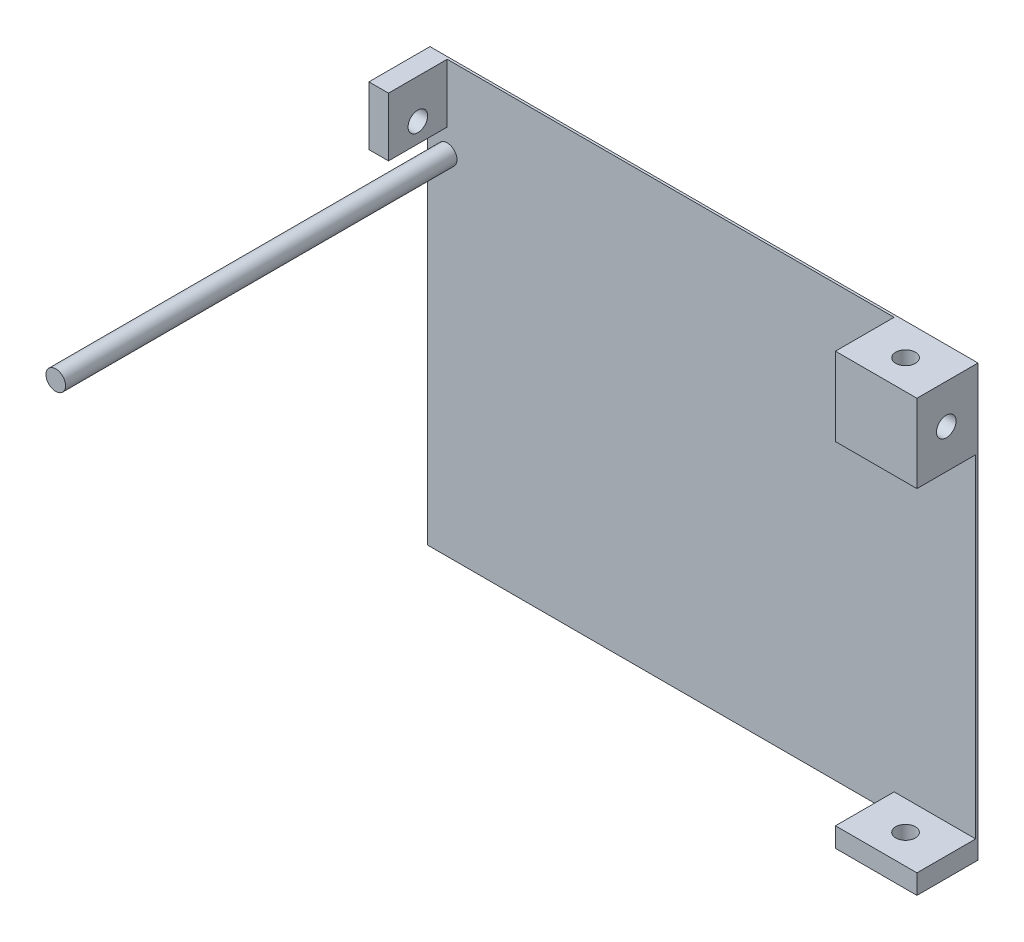
ISO-10303-21;
HEADER;
FILE_DESCRIPTION(('STEP AP214'),'2;1');
FILE_NAME('part.step','',(''),(''),'','','');
FILE_SCHEMA(('AUTOMOTIVE_DESIGN { 1 0 10303 214 1 1 1 1 }'));
ENDSEC;
DATA;
#1=APPLICATION_CONTEXT('core data for automotive mechanical design processes');
#2=APPLICATION_PROTOCOL_DEFINITION('international standard','automotive_design',2000,#1);
#3=PRODUCT_CONTEXT('',#1,'mechanical');
#4=PRODUCT('Part','Part','',(#3));
#5=PRODUCT_RELATED_PRODUCT_CATEGORY('part','',(#4));
#6=PRODUCT_DEFINITION_FORMATION('','',#4);
#7=PRODUCT_DEFINITION_CONTEXT('part definition',#1,'design');
#8=PRODUCT_DEFINITION('design','',#6,#7);
#9=PRODUCT_DEFINITION_SHAPE('','',#8);
#10=(LENGTH_UNIT() NAMED_UNIT(*) SI_UNIT(.MILLI.,.METRE.));
#11=(NAMED_UNIT(*) PLANE_ANGLE_UNIT() SI_UNIT($,.RADIAN.));
#12=(NAMED_UNIT(*) SI_UNIT($,.STERADIAN.) SOLID_ANGLE_UNIT());
#13=UNCERTAINTY_MEASURE_WITH_UNIT(LENGTH_MEASURE(1.E-05),#10,'distance_accuracy_value','');
#14=(GEOMETRIC_REPRESENTATION_CONTEXT(3) GLOBAL_UNCERTAINTY_ASSIGNED_CONTEXT((#13)) GLOBAL_UNIT_ASSIGNED_CONTEXT((#10,
#11,#12)) REPRESENTATION_CONTEXT('',''));
#15=CARTESIAN_POINT('',(0.,0.,0.));
#16=DIRECTION('',(0.,0.,1.));
#17=DIRECTION('',(1.,0.,0.));
#18=AXIS2_PLACEMENT_3D('',#15,#16,#17);
#19=CARTESIAN_POINT('',(297.95271691231,295.,40.5));
#20=DIRECTION('',(0.,-1.,0.));
#21=DIRECTION('',(1.,0.,0.));
#22=AXIS2_PLACEMENT_3D('',#19,#20,#21);
#23=CYLINDRICAL_SURFACE('',#22,12.5);
#24=CARTESIAN_POINT('',(297.95271691231,175.,40.5));
#25=DIRECTION('',(0.,1.,0.));
#26=DIRECTION('',(-1.,0.,0.));
#27=AXIS2_PLACEMENT_3D('',#24,#25,#26);
#28=CIRCLE('',#27,12.5);
#29=CARTESIAN_POINT('',(285.45271691231,175.,40.5));
#30=VERTEX_POINT('',#29);
#31=EDGE_CURVE('E166',#30,#30,#28,.T.);
#32=ORIENTED_EDGE('',*,*,#31,.F.);
#33=EDGE_LOOP('',(#32));
#34=FACE_BOUND('',#33,.T.);
#35=CARTESIAN_POINT('',(297.95271691231,225.,40.5));
#36=DIRECTION('',(-0.707106781186547,-0.707106781186547,0.));
#37=DIRECTION('',(0.707106781186547,-0.707106781186547,0.));
#38=AXIS2_PLACEMENT_3D('',#35,#36,#37);
#39=ELLIPSE('',#38,17.6776695296637,12.5);
#40=CARTESIAN_POINT('',(297.95271691231,225.,53.));
#41=VERTEX_POINT('',#40);
#42=CARTESIAN_POINT('',(297.95271691231,225.,28.));
#43=VERTEX_POINT('',#42);
#44=EDGE_CURVE('E57',#41,#43,#39,.F.);
#45=ORIENTED_EDGE('',*,*,#44,.T.);
#46=CARTESIAN_POINT('',(297.95271691231,225.,40.5));
#47=DIRECTION('',(0.707106781186547,-0.707106781186547,0.));
#48=DIRECTION('',(-0.707106781186547,-0.707106781186547,0.));
#49=AXIS2_PLACEMENT_3D('',#46,#47,#48);
#50=ELLIPSE('',#49,17.6776695296637,12.5);
#51=EDGE_CURVE('E11',#43,#41,#50,.F.);
#52=ORIENTED_EDGE('',*,*,#51,.T.);
#53=EDGE_LOOP('',(#45,#52));
#54=FACE_BOUND('',#53,.T.);
#55=ADVANCED_FACE('F43',(#34,#54),#23,.F.);
#56=CARTESIAN_POINT('',(0.,0.,3.));
#57=DIRECTION('',(0.,0.,1.));
#58=DIRECTION('',(1.,0.,0.));
#59=AXIS2_PLACEMENT_3D('',#56,#57,#58);
#60=PLANE('',#59);
#61=CARTESIAN_POINT('',(-325.,170.,3.));
#62=DIRECTION('',(0.,0.,1.));
#63=DIRECTION('',(1.,0.,0.));
#64=AXIS2_PLACEMENT_3D('',#61,#62,#63);
#65=CIRCLE('',#64,12.5);
#66=CARTESIAN_POINT('',(-312.5,170.,3.));
#67=VERTEX_POINT('',#66);
#68=EDGE_CURVE('E334',#67,#67,#65,.T.);
#69=ORIENTED_EDGE('',*,*,#68,.F.);
#70=EDGE_LOOP('',(#69));
#71=FACE_BOUND('',#70,.T.);
#72=DIRECTION('',(1.,0.,0.));
#73=VECTOR('',#72,1.);
#74=CARTESIAN_POINT('',(350.,-275.,3.));
#75=LINE('',#74,#73);
#76=CARTESIAN_POINT('',(-350.,-275.,3.));
#77=VERTEX_POINT('',#76);
#78=CARTESIAN_POINT('',(245.90543382462,-275.,3.));
#79=VERTEX_POINT('',#78);
#80=EDGE_CURVE('E204',#77,#79,#75,.T.);
#81=ORIENTED_EDGE('',*,*,#80,.T.);
#82=DIRECTION('',(0.,-1.,0.));
#83=VECTOR('',#82,1.);
#84=CARTESIAN_POINT('',(245.90543382462,-275.,3.));
#85=LINE('',#84,#83);
#86=CARTESIAN_POINT('',(245.90543382462,-250.,3.));
#87=VERTEX_POINT('',#86);
#88=EDGE_CURVE('E65',#87,#79,#85,.T.);
#89=ORIENTED_EDGE('',*,*,#88,.F.);
#90=DIRECTION('',(-1.,0.,0.));
#91=VECTOR('',#90,1.);
#92=CARTESIAN_POINT('',(245.90543382462,-250.,3.));
#93=LINE('',#92,#91);
#94=CARTESIAN_POINT('',(350.,-250.,3.));
#95=VERTEX_POINT('',#94);
#96=EDGE_CURVE('E280',#95,#87,#93,.T.);
#97=ORIENTED_EDGE('',*,*,#96,.F.);
#98=DIRECTION('',(0.,1.,0.));
#99=VECTOR('',#98,1.);
#100=CARTESIAN_POINT('',(350.,-275.,3.));
#101=LINE('',#100,#99);
#102=CARTESIAN_POINT('',(350.,175.,3.));
#103=VERTEX_POINT('',#102);
#104=EDGE_CURVE('E201',#95,#103,#101,.T.);
#105=ORIENTED_EDGE('',*,*,#104,.T.);
#106=DIRECTION('',(1.,0.,0.));
#107=VECTOR('',#106,1.);
#108=CARTESIAN_POINT('',(350.,175.,3.));
#109=LINE('',#108,#107);
#110=CARTESIAN_POINT('',(245.90543382462,175.,3.));
#111=VERTEX_POINT('',#110);
#112=EDGE_CURVE('E221',#111,#103,#109,.T.);
#113=ORIENTED_EDGE('',*,*,#112,.F.);
#114=DIRECTION('',(0.,-1.,0.));
#115=VECTOR('',#114,1.);
#116=CARTESIAN_POINT('',(245.90543382462,275.,3.));
#117=LINE('',#116,#115);
#118=CARTESIAN_POINT('',(245.90543382462,275.,3.));
#119=VERTEX_POINT('',#118);
#120=EDGE_CURVE('E226',#119,#111,#117,.T.);
#121=ORIENTED_EDGE('',*,*,#120,.F.);
#122=DIRECTION('',(-1.,0.,0.));
#123=VECTOR('',#122,1.);
#124=CARTESIAN_POINT('',(350.,275.,3.));
#125=LINE('',#124,#123);
#126=CARTESIAN_POINT('',(-325.,275.,3.));
#127=VERTEX_POINT('',#126);
#128=EDGE_CURVE('E183',#119,#127,#125,.T.);
#129=ORIENTED_EDGE('',*,*,#128,.T.);
#130=DIRECTION('',(0.,1.,0.));
#131=VECTOR('',#130,1.);
#132=CARTESIAN_POINT('',(-325.,275.,3.));
#133=LINE('',#132,#131);
#134=CARTESIAN_POINT('',(-325.,200.,3.));
#135=VERTEX_POINT('',#134);
#136=EDGE_CURVE('E247',#135,#127,#133,.T.);
#137=ORIENTED_EDGE('',*,*,#136,.F.);
#138=DIRECTION('',(1.,0.,0.));
#139=VECTOR('',#138,1.);
#140=CARTESIAN_POINT('',(-350.,200.,3.));
#141=LINE('',#140,#139);
#142=CARTESIAN_POINT('',(-350.,200.,3.));
#143=VERTEX_POINT('',#142);
#144=EDGE_CURVE('E230',#143,#135,#141,.T.);
#145=ORIENTED_EDGE('',*,*,#144,.F.);
#146=DIRECTION('',(0.,-1.,0.));
#147=VECTOR('',#146,1.);
#148=CARTESIAN_POINT('',(-350.,-275.,3.));
#149=LINE('',#148,#147);
#150=EDGE_CURVE('E187',#143,#77,#149,.T.);
#151=ORIENTED_EDGE('',*,*,#150,.T.);
#152=EDGE_LOOP('',(#81,#89,#97,#105,#113,#121,#129,#137,#145,#151));
#153=FACE_BOUND('',#152,.T.);
#154=ADVANCED_FACE('F351',(#71,#153),#60,.T.);
#155=CARTESIAN_POINT('',(-350.,-275.,3.));
#156=DIRECTION('',(1.,0.,0.));
#157=DIRECTION('',(0.,0.,-1.));
#158=AXIS2_PLACEMENT_3D('',#155,#156,#157);
#159=PLANE('',#158);
#160=CARTESIAN_POINT('',(-350.,225.,40.5));
#161=DIRECTION('',(1.,0.,0.));
#162=DIRECTION('',(0.,0.,-1.));
#163=AXIS2_PLACEMENT_3D('',#160,#161,#162);
#164=CIRCLE('',#163,12.5);
#165=CARTESIAN_POINT('',(-350.,225.,28.));
#166=VERTEX_POINT('',#165);
#167=EDGE_CURVE('E317',#166,#166,#164,.T.);
#168=ORIENTED_EDGE('',*,*,#167,.T.);
#169=EDGE_LOOP('',(#168));
#170=FACE_BOUND('',#169,.T.);
#171=DIRECTION('',(0.,-1.,0.));
#172=VECTOR('',#171,1.);
#173=CARTESIAN_POINT('',(-350.,-275.,0.));
#174=LINE('',#173,#172);
#175=CARTESIAN_POINT('',(-350.,275.,0.));
#176=VERTEX_POINT('',#175);
#177=CARTESIAN_POINT('',(-350.,-275.,0.));
#178=VERTEX_POINT('',#177);
#179=EDGE_CURVE('E194',#176,#178,#174,.T.);
#180=ORIENTED_EDGE('',*,*,#179,.T.);
#181=DIRECTION('',(0.,0.,-1.));
#182=VECTOR('',#181,1.);
#183=CARTESIAN_POINT('',(-350.,-275.,3.));
#184=LINE('',#183,#182);
#185=EDGE_CURVE('E156',#77,#178,#184,.T.);
#186=ORIENTED_EDGE('',*,*,#185,.F.);
#187=ORIENTED_EDGE('',*,*,#150,.F.);
#188=DIRECTION('',(0.,0.,-1.));
#189=VECTOR('',#188,1.);
#190=CARTESIAN_POINT('',(-350.,200.,78.));
#191=LINE('',#190,#189);
#192=CARTESIAN_POINT('',(-350.,200.,78.));
#193=VERTEX_POINT('',#192);
#194=EDGE_CURVE('E272',#193,#143,#191,.T.);
#195=ORIENTED_EDGE('',*,*,#194,.F.);
#196=DIRECTION('',(0.,-1.,0.));
#197=VECTOR('',#196,1.);
#198=CARTESIAN_POINT('',(-350.,275.,78.));
#199=LINE('',#198,#197);
#200=CARTESIAN_POINT('',(-350.,275.,78.));
#201=VERTEX_POINT('',#200);
#202=EDGE_CURVE('E243',#201,#193,#199,.T.);
#203=ORIENTED_EDGE('',*,*,#202,.F.);
#204=DIRECTION('',(0.,0.,-1.));
#205=VECTOR('',#204,1.);
#206=CARTESIAN_POINT('',(-350.,275.,3.));
#207=LINE('',#206,#205);
#208=EDGE_CURVE('E179',#201,#176,#207,.T.);
#209=ORIENTED_EDGE('',*,*,#208,.T.);
#210=EDGE_LOOP('',(#180,#186,#187,#195,#203,#209));
#211=FACE_BOUND('',#210,.T.);
#212=ADVANCED_FACE('F45',(#170,#211),#159,.F.);
#213=CARTESIAN_POINT('',(350.,-275.,3.));
#214=DIRECTION('',(0.,1.,0.));
#215=DIRECTION('',(-1.,0.,0.));
#216=AXIS2_PLACEMENT_3D('',#213,#214,#215);
#217=PLANE('',#216);
#218=CARTESIAN_POINT('',(297.95271691231,-275.,40.5));
#219=DIRECTION('',(0.,-1.,0.));
#220=DIRECTION('',(1.,0.,0.));
#221=AXIS2_PLACEMENT_3D('',#218,#219,#220);
#222=CIRCLE('',#221,12.5);
#223=CARTESIAN_POINT('',(310.45271691231,-275.,40.5));
#224=VERTEX_POINT('',#223);
#225=EDGE_CURVE('E167',#224,#224,#222,.T.);
#226=ORIENTED_EDGE('',*,*,#225,.F.);
#227=EDGE_LOOP('',(#226));
#228=FACE_BOUND('',#227,.T.);
#229=DIRECTION('',(1.,0.,0.));
#230=VECTOR('',#229,1.);
#231=CARTESIAN_POINT('',(350.,-275.,0.));
#232=LINE('',#231,#230);
#233=CARTESIAN_POINT('',(350.,-275.,0.));
#234=VERTEX_POINT('',#233);
#235=EDGE_CURVE('E191',#178,#234,#232,.T.);
#236=ORIENTED_EDGE('',*,*,#235,.T.);
#237=DIRECTION('',(0.,0.,-1.));
#238=VECTOR('',#237,1.);
#239=CARTESIAN_POINT('',(350.,-275.,3.));
#240=LINE('',#239,#238);
#241=CARTESIAN_POINT('',(350.,-275.,78.));
#242=VERTEX_POINT('',#241);
#243=EDGE_CURVE('E171',#242,#234,#240,.T.);
#244=ORIENTED_EDGE('',*,*,#243,.F.);
#245=DIRECTION('',(1.,0.,0.));
#246=VECTOR('',#245,1.);
#247=CARTESIAN_POINT('',(245.90543382462,-275.,78.));
#248=LINE('',#247,#246);
#249=CARTESIAN_POINT('',(245.90543382462,-275.,78.));
#250=VERTEX_POINT('',#249);
#251=EDGE_CURVE('E281',#250,#242,#248,.T.);
#252=ORIENTED_EDGE('',*,*,#251,.F.);
#253=DIRECTION('',(0.,0.,-1.));
#254=VECTOR('',#253,1.);
#255=CARTESIAN_POINT('',(245.90543382462,-275.,78.));
#256=LINE('',#255,#254);
#257=EDGE_CURVE('E303',#250,#79,#256,.T.);
#258=ORIENTED_EDGE('',*,*,#257,.T.);
#259=ORIENTED_EDGE('',*,*,#80,.F.);
#260=ORIENTED_EDGE('',*,*,#185,.T.);
#261=EDGE_LOOP('',(#236,#244,#252,#258,#259,#260));
#262=FACE_BOUND('',#261,.T.);
#263=ADVANCED_FACE('F359',(#228,#262),#217,.F.);
#264=CARTESIAN_POINT('',(350.,-275.,3.));
#265=DIRECTION('',(-1.,0.,0.));
#266=DIRECTION('',(0.,-1.,0.));
#267=AXIS2_PLACEMENT_3D('',#264,#265,#266);
#268=PLANE('',#267);
#269=CARTESIAN_POINT('',(350.,225.,40.5));
#270=DIRECTION('',(1.,0.,0.));
#271=DIRECTION('',(0.,1.,0.));
#272=AXIS2_PLACEMENT_3D('',#269,#270,#271);
#273=CIRCLE('',#272,12.5);
#274=CARTESIAN_POINT('',(350.,237.5,40.5));
#275=VERTEX_POINT('',#274);
#276=EDGE_CURVE('E329',#275,#275,#273,.T.);
#277=ORIENTED_EDGE('',*,*,#276,.F.);
#278=EDGE_LOOP('',(#277));
#279=FACE_BOUND('',#278,.T.);
#280=DIRECTION('',(0.,1.,0.));
#281=VECTOR('',#280,1.);
#282=CARTESIAN_POINT('',(350.,-275.,0.));
#283=LINE('',#282,#281);
#284=CARTESIAN_POINT('',(350.,275.,0.));
#285=VERTEX_POINT('',#284);
#286=EDGE_CURVE('E188',#234,#285,#283,.T.);
#287=ORIENTED_EDGE('',*,*,#286,.T.);
#288=DIRECTION('',(0.,0.,-1.));
#289=VECTOR('',#288,1.);
#290=CARTESIAN_POINT('',(350.,275.,3.));
#291=LINE('',#290,#289);
#292=CARTESIAN_POINT('',(350.,275.,78.));
#293=VERTEX_POINT('',#292);
#294=EDGE_CURVE('E175',#293,#285,#291,.T.);
#295=ORIENTED_EDGE('',*,*,#294,.F.);
#296=DIRECTION('',(0.,1.,0.));
#297=VECTOR('',#296,1.);
#298=CARTESIAN_POINT('',(350.,200.,78.));
#299=LINE('',#298,#297);
#300=CARTESIAN_POINT('',(350.,175.,78.));
#301=VERTEX_POINT('',#300);
#302=EDGE_CURVE('E220',#301,#293,#299,.T.);
#303=ORIENTED_EDGE('',*,*,#302,.F.);
#304=DIRECTION('',(0.,0.,-1.));
#305=VECTOR('',#304,1.);
#306=CARTESIAN_POINT('',(350.,175.,78.));
#307=LINE('',#306,#305);
#308=EDGE_CURVE('E216',#301,#103,#307,.T.);
#309=ORIENTED_EDGE('',*,*,#308,.T.);
#310=ORIENTED_EDGE('',*,*,#104,.F.);
#311=DIRECTION('',(0.,0.,-1.));
#312=VECTOR('',#311,1.);
#313=CARTESIAN_POINT('',(350.,-250.,78.));
#314=LINE('',#313,#312);
#315=CARTESIAN_POINT('',(350.,-250.,78.));
#316=VERTEX_POINT('',#315);
#317=EDGE_CURVE('E299',#316,#95,#314,.T.);
#318=ORIENTED_EDGE('',*,*,#317,.F.);
#319=DIRECTION('',(0.,1.,0.));
#320=VECTOR('',#319,1.);
#321=CARTESIAN_POINT('',(350.,-275.,78.));
#322=LINE('',#321,#320);
#323=EDGE_CURVE('E285',#242,#316,#322,.T.);
#324=ORIENTED_EDGE('',*,*,#323,.F.);
#325=ORIENTED_EDGE('',*,*,#243,.T.);
#326=EDGE_LOOP('',(#287,#295,#303,#309,#310,#318,#324,#325));
#327=FACE_BOUND('',#326,.T.);
#328=ADVANCED_FACE('F375',(#279,#327),#268,.F.);
#329=CARTESIAN_POINT('',(350.,275.,3.));
#330=DIRECTION('',(0.,-1.,0.));
#331=DIRECTION('',(1.,0.,0.));
#332=AXIS2_PLACEMENT_3D('',#329,#330,#331);
#333=PLANE('',#332);
#334=CARTESIAN_POINT('',(297.95271691231,275.,40.5));
#335=DIRECTION('',(0.,-1.,0.));
#336=DIRECTION('',(1.,0.,0.));
#337=AXIS2_PLACEMENT_3D('',#334,#335,#336);
#338=CIRCLE('',#337,12.5);
#339=CARTESIAN_POINT('',(310.45271691231,275.,40.5));
#340=VERTEX_POINT('',#339);
#341=EDGE_CURVE('E307',#340,#340,#338,.T.);
#342=ORIENTED_EDGE('',*,*,#341,.T.);
#343=EDGE_LOOP('',(#342));
#344=FACE_BOUND('',#343,.T.);
#345=DIRECTION('',(-1.,0.,0.));
#346=VECTOR('',#345,1.);
#347=CARTESIAN_POINT('',(350.,275.,0.));
#348=LINE('',#347,#346);
#349=EDGE_CURVE('E184',#285,#176,#348,.T.);
#350=ORIENTED_EDGE('',*,*,#349,.T.);
#351=ORIENTED_EDGE('',*,*,#208,.F.);
#352=DIRECTION('',(-1.,0.,0.));
#353=VECTOR('',#352,1.);
#354=CARTESIAN_POINT('',(-350.,275.,78.));
#355=LINE('',#354,#353);
#356=CARTESIAN_POINT('',(-325.,275.,78.));
#357=VERTEX_POINT('',#356);
#358=EDGE_CURVE('E254',#357,#201,#355,.T.);
#359=ORIENTED_EDGE('',*,*,#358,.F.);
#360=DIRECTION('',(0.,0.,-1.));
#361=VECTOR('',#360,1.);
#362=CARTESIAN_POINT('',(-325.,275.,78.));
#363=LINE('',#362,#361);
#364=EDGE_CURVE('E258',#357,#127,#363,.T.);
#365=ORIENTED_EDGE('',*,*,#364,.T.);
#366=ORIENTED_EDGE('',*,*,#128,.F.);
#367=DIRECTION('',(0.,0.,-1.));
#368=VECTOR('',#367,1.);
#369=CARTESIAN_POINT('',(245.90543382462,275.,78.));
#370=LINE('',#369,#368);
#371=CARTESIAN_POINT('',(245.90543382462,275.,78.));
#372=VERTEX_POINT('',#371);
#373=EDGE_CURVE('E198',#372,#119,#370,.T.);
#374=ORIENTED_EDGE('',*,*,#373,.F.);
#375=DIRECTION('',(-1.,0.,0.));
#376=VECTOR('',#375,1.);
#377=CARTESIAN_POINT('',(350.,275.,78.));
#378=LINE('',#377,#376);
#379=EDGE_CURVE('E225',#293,#372,#378,.T.);
#380=ORIENTED_EDGE('',*,*,#379,.F.);
#381=ORIENTED_EDGE('',*,*,#294,.T.);
#382=EDGE_LOOP('',(#350,#351,#359,#365,#366,#374,#380,#381));
#383=FACE_BOUND('',#382,.T.);
#384=ADVANCED_FACE('F381',(#344,#383),#333,.F.);
#385=CARTESIAN_POINT('',(0.,0.,0.));
#386=DIRECTION('',(0.,0.,1.));
#387=DIRECTION('',(1.,0.,0.));
#388=AXIS2_PLACEMENT_3D('',#385,#386,#387);
#389=PLANE('',#388);
#390=ORIENTED_EDGE('',*,*,#179,.F.);
#391=ORIENTED_EDGE('',*,*,#349,.F.);
#392=ORIENTED_EDGE('',*,*,#286,.F.);
#393=ORIENTED_EDGE('',*,*,#235,.F.);
#394=EDGE_LOOP('',(#390,#391,#392,#393));
#395=FACE_BOUND('',#394,.T.);
#396=ADVANCED_FACE('F452',(#395),#389,.F.);
#397=CARTESIAN_POINT('',(245.90543382462,275.,78.));
#398=DIRECTION('',(1.,0.,0.));
#399=DIRECTION('',(0.,0.,-1.));
#400=AXIS2_PLACEMENT_3D('',#397,#398,#399);
#401=PLANE('',#400);
#402=CARTESIAN_POINT('',(245.90543382462,225.,40.5));
#403=DIRECTION('',(1.,0.,0.));
#404=DIRECTION('',(0.,0.,-1.));
#405=AXIS2_PLACEMENT_3D('',#402,#403,#404);
#406=CIRCLE('',#405,12.5);
#407=CARTESIAN_POINT('',(245.90543382462,225.,28.));
#408=VERTEX_POINT('',#407);
#409=EDGE_CURVE('E321',#408,#408,#406,.T.);
#410=ORIENTED_EDGE('',*,*,#409,.T.);
#411=EDGE_LOOP('',(#410));
#412=FACE_BOUND('',#411,.T.);
#413=ORIENTED_EDGE('',*,*,#120,.T.);
#414=DIRECTION('',(0.,0.,-1.));
#415=VECTOR('',#414,1.);
#416=CARTESIAN_POINT('',(245.90543382462,175.,78.));
#417=LINE('',#416,#415);
#418=CARTESIAN_POINT('',(245.90543382462,175.,78.));
#419=VERTEX_POINT('',#418);
#420=EDGE_CURVE('E212',#419,#111,#417,.T.);
#421=ORIENTED_EDGE('',*,*,#420,.F.);
#422=DIRECTION('',(0.,-1.,0.));
#423=VECTOR('',#422,1.);
#424=CARTESIAN_POINT('',(245.90543382462,275.,78.));
#425=LINE('',#424,#423);
#426=EDGE_CURVE('E237',#372,#419,#425,.T.);
#427=ORIENTED_EDGE('',*,*,#426,.F.);
#428=ORIENTED_EDGE('',*,*,#373,.T.);
#429=EDGE_LOOP('',(#413,#421,#427,#428));
#430=FACE_BOUND('',#429,.T.);
#431=ADVANCED_FACE('F385',(#412,#430),#401,.F.);
#432=CARTESIAN_POINT('',(350.,175.,78.));
#433=DIRECTION('',(0.,1.,0.));
#434=DIRECTION('',(-1.,0.,0.));
#435=AXIS2_PLACEMENT_3D('',#432,#433,#434);
#436=PLANE('',#435);
#437=ORIENTED_EDGE('',*,*,#31,.T.);
#438=EDGE_LOOP('',(#437));
#439=FACE_BOUND('',#438,.T.);
#440=ORIENTED_EDGE('',*,*,#112,.T.);
#441=ORIENTED_EDGE('',*,*,#308,.F.);
#442=DIRECTION('',(1.,0.,0.));
#443=VECTOR('',#442,1.);
#444=CARTESIAN_POINT('',(350.,175.,78.));
#445=LINE('',#444,#443);
#446=EDGE_CURVE('E234',#419,#301,#445,.T.);
#447=ORIENTED_EDGE('',*,*,#446,.F.);
#448=ORIENTED_EDGE('',*,*,#420,.T.);
#449=EDGE_LOOP('',(#440,#441,#447,#448));
#450=FACE_BOUND('',#449,.T.);
#451=ADVANCED_FACE('F371',(#439,#450),#436,.F.);
#452=CARTESIAN_POINT('',(0.,0.,78.));
#453=DIRECTION('',(0.,0.,1.));
#454=DIRECTION('',(1.,0.,0.));
#455=AXIS2_PLACEMENT_3D('',#452,#453,#454);
#456=PLANE('',#455);
#457=ORIENTED_EDGE('',*,*,#379,.T.);
#458=ORIENTED_EDGE('',*,*,#426,.T.);
#459=ORIENTED_EDGE('',*,*,#446,.T.);
#460=ORIENTED_EDGE('',*,*,#302,.T.);
#461=EDGE_LOOP('',(#457,#458,#459,#460));
#462=FACE_BOUND('',#461,.T.);
#463=ADVANCED_FACE('F378',(#462),#456,.T.);
#464=CARTESIAN_POINT('',(-350.,200.,78.));
#465=DIRECTION('',(0.,1.,0.));
#466=DIRECTION('',(0.,0.,1.));
#467=AXIS2_PLACEMENT_3D('',#464,#465,#466);
#468=PLANE('',#467);
#469=ORIENTED_EDGE('',*,*,#144,.T.);
#470=DIRECTION('',(0.,0.,-1.));
#471=VECTOR('',#470,1.);
#472=CARTESIAN_POINT('',(-325.,200.,78.));
#473=LINE('',#472,#471);
#474=CARTESIAN_POINT('',(-325.,200.,78.));
#475=VERTEX_POINT('',#474);
#476=EDGE_CURVE('E268',#475,#135,#473,.T.);
#477=ORIENTED_EDGE('',*,*,#476,.F.);
#478=DIRECTION('',(1.,0.,0.));
#479=VECTOR('',#478,1.);
#480=CARTESIAN_POINT('',(-350.,200.,78.));
#481=LINE('',#480,#479);
#482=EDGE_CURVE('E248',#193,#475,#481,.T.);
#483=ORIENTED_EDGE('',*,*,#482,.F.);
#484=ORIENTED_EDGE('',*,*,#194,.T.);
#485=EDGE_LOOP('',(#469,#477,#483,#484));
#486=FACE_BOUND('',#485,.T.);
#487=ADVANCED_FACE('F399',(#486),#468,.F.);
#488=CARTESIAN_POINT('',(-325.,275.,78.));
#489=DIRECTION('',(-1.,0.,0.));
#490=DIRECTION('',(0.,0.,1.));
#491=AXIS2_PLACEMENT_3D('',#488,#489,#490);
#492=PLANE('',#491);
#493=CARTESIAN_POINT('',(-325.,225.,40.5));
#494=DIRECTION('',(-1.,0.,0.));
#495=DIRECTION('',(0.,0.,1.));
#496=AXIS2_PLACEMENT_3D('',#493,#494,#495);
#497=CIRCLE('',#496,12.5);
#498=CARTESIAN_POINT('',(-325.,225.,53.));
#499=VERTEX_POINT('',#498);
#500=EDGE_CURVE('E325',#499,#499,#497,.T.);
#501=ORIENTED_EDGE('',*,*,#500,.T.);
#502=EDGE_LOOP('',(#501));
#503=FACE_BOUND('',#502,.T.);
#504=ORIENTED_EDGE('',*,*,#136,.T.);
#505=ORIENTED_EDGE('',*,*,#364,.F.);
#506=DIRECTION('',(0.,1.,0.));
#507=VECTOR('',#506,1.);
#508=CARTESIAN_POINT('',(-325.,275.,78.));
#509=LINE('',#508,#507);
#510=EDGE_CURVE('E251',#475,#357,#509,.T.);
#511=ORIENTED_EDGE('',*,*,#510,.F.);
#512=ORIENTED_EDGE('',*,*,#476,.T.);
#513=EDGE_LOOP('',(#504,#505,#511,#512));
#514=FACE_BOUND('',#513,.T.);
#515=ADVANCED_FACE('F388',(#503,#514),#492,.F.);
#516=CARTESIAN_POINT('',(0.,0.,78.));
#517=DIRECTION('',(0.,0.,1.));
#518=DIRECTION('',(1.,0.,0.));
#519=AXIS2_PLACEMENT_3D('',#516,#517,#518);
#520=PLANE('',#519);
#521=ORIENTED_EDGE('',*,*,#202,.T.);
#522=ORIENTED_EDGE('',*,*,#482,.T.);
#523=ORIENTED_EDGE('',*,*,#510,.T.);
#524=ORIENTED_EDGE('',*,*,#358,.T.);
#525=EDGE_LOOP('',(#521,#522,#523,#524));
#526=FACE_BOUND('',#525,.T.);
#527=ADVANCED_FACE('F394',(#526),#520,.T.);
#528=CARTESIAN_POINT('',(245.90543382462,-275.,78.));
#529=DIRECTION('',(1.,0.,0.));
#530=DIRECTION('',(0.,0.,-1.));
#531=AXIS2_PLACEMENT_3D('',#528,#529,#530);
#532=PLANE('',#531);
#533=ORIENTED_EDGE('',*,*,#88,.T.);
#534=ORIENTED_EDGE('',*,*,#257,.F.);
#535=DIRECTION('',(0.,-1.,0.));
#536=VECTOR('',#535,1.);
#537=CARTESIAN_POINT('',(245.90543382462,-275.,78.));
#538=LINE('',#537,#536);
#539=CARTESIAN_POINT('',(245.90543382462,-250.,78.));
#540=VERTEX_POINT('',#539);
#541=EDGE_CURVE('E276',#540,#250,#538,.T.);
#542=ORIENTED_EDGE('',*,*,#541,.F.);
#543=DIRECTION('',(0.,0.,-1.));
#544=VECTOR('',#543,1.);
#545=CARTESIAN_POINT('',(245.90543382462,-250.,78.));
#546=LINE('',#545,#544);
#547=EDGE_CURVE('E291',#540,#87,#546,.T.);
#548=ORIENTED_EDGE('',*,*,#547,.T.);
#549=EDGE_LOOP('',(#533,#534,#542,#548));
#550=FACE_BOUND('',#549,.T.);
#551=ADVANCED_FACE('F362',(#550),#532,.F.);
#552=CARTESIAN_POINT('',(245.90543382462,-250.,78.));
#553=DIRECTION('',(0.,-1.,0.));
#554=DIRECTION('',(0.,0.,-1.));
#555=AXIS2_PLACEMENT_3D('',#552,#553,#554);
#556=PLANE('',#555);
#557=CARTESIAN_POINT('',(297.95271691231,-250.,40.5));
#558=DIRECTION('',(0.,-1.,0.));
#559=DIRECTION('',(0.,0.,-1.));
#560=AXIS2_PLACEMENT_3D('',#557,#558,#559);
#561=CIRCLE('',#560,12.5);
#562=CARTESIAN_POINT('',(310.45271691231,-250.,40.5));
#563=VERTEX_POINT('',#562);
#564=EDGE_CURVE('E162',#563,#563,#561,.T.);
#565=ORIENTED_EDGE('',*,*,#564,.T.);
#566=EDGE_LOOP('',(#565));
#567=FACE_BOUND('',#566,.T.);
#568=ORIENTED_EDGE('',*,*,#96,.T.);
#569=ORIENTED_EDGE('',*,*,#547,.F.);
#570=DIRECTION('',(-1.,0.,0.));
#571=VECTOR('',#570,1.);
#572=CARTESIAN_POINT('',(245.90543382462,-250.,78.));
#573=LINE('',#572,#571);
#574=EDGE_CURVE('E288',#316,#540,#573,.T.);
#575=ORIENTED_EDGE('',*,*,#574,.F.);
#576=ORIENTED_EDGE('',*,*,#317,.T.);
#577=EDGE_LOOP('',(#568,#569,#575,#576));
#578=FACE_BOUND('',#577,.T.);
#579=ADVANCED_FACE('F366',(#567,#578),#556,.F.);
#580=CARTESIAN_POINT('',(0.,0.,78.));
#581=DIRECTION('',(0.,0.,-1.));
#582=DIRECTION('',(-1.,0.,0.));
#583=AXIS2_PLACEMENT_3D('',#580,#581,#582);
#584=PLANE('',#583);
#585=ORIENTED_EDGE('',*,*,#541,.T.);
#586=ORIENTED_EDGE('',*,*,#251,.T.);
#587=ORIENTED_EDGE('',*,*,#323,.T.);
#588=ORIENTED_EDGE('',*,*,#574,.T.);
#589=EDGE_LOOP('',(#585,#586,#587,#588));
#590=FACE_BOUND('',#589,.T.);
#591=ADVANCED_FACE('F420',(#590),#584,.F.);
#592=CARTESIAN_POINT('',(310.45271691231,-275.,40.5));
#593=CARTESIAN_POINT('',(310.45271691231,-274.739583333333,40.5));
#594=CARTESIAN_POINT('',(310.45271691231,-274.479166666667,40.5));
#595=CARTESIAN_POINT('',(310.45271691231,-273.958333333333,40.5));
#596=CARTESIAN_POINT('',(310.45271691231,-273.697916666666,40.5));
#597=CARTESIAN_POINT('',(310.45271691231,-273.177083333333,40.5));
#598=CARTESIAN_POINT('',(310.45271691231,-272.916666666666,40.5));
#599=CARTESIAN_POINT('',(310.45271691231,-272.395833333333,40.5));
#600=CARTESIAN_POINT('',(310.45271691231,-272.135416666666,40.5));
#601=CARTESIAN_POINT('',(310.45271691231,-271.614583333333,40.5));
#602=CARTESIAN_POINT('',(310.45271691231,-271.354166666666,40.5));
#603=CARTESIAN_POINT('',(310.45271691231,-270.833333333333,40.5));
#604=CARTESIAN_POINT('',(310.45271691231,-270.572916666667,40.5));
#605=CARTESIAN_POINT('',(310.45271691231,-270.052083333333,40.5));
#606=CARTESIAN_POINT('',(310.45271691231,-269.791666666666,40.5));
#607=CARTESIAN_POINT('',(310.45271691231,-269.270833333333,40.5));
#608=CARTESIAN_POINT('',(310.45271691231,-269.010416666666,40.5));
#609=CARTESIAN_POINT('',(310.45271691231,-268.489583333333,40.5));
#610=CARTESIAN_POINT('',(310.45271691231,-268.229166666667,40.5));
#611=CARTESIAN_POINT('',(310.45271691231,-267.708333333333,40.5));
#612=CARTESIAN_POINT('',(310.45271691231,-267.447916666667,40.5));
#613=CARTESIAN_POINT('',(310.45271691231,-266.927083333333,40.5));
#614=CARTESIAN_POINT('',(310.45271691231,-266.666666666667,40.5));
#615=CARTESIAN_POINT('',(310.45271691231,-266.145833333333,40.5));
#616=CARTESIAN_POINT('',(310.45271691231,-265.885416666667,40.5));
#617=CARTESIAN_POINT('',(310.45271691231,-265.364583333333,40.5));
#618=CARTESIAN_POINT('',(310.45271691231,-265.104166666667,40.5));
#619=CARTESIAN_POINT('',(310.45271691231,-264.583333333333,40.5));
#620=CARTESIAN_POINT('',(310.45271691231,-264.322916666667,40.5));
#621=CARTESIAN_POINT('',(310.45271691231,-263.802083333333,40.5));
#622=CARTESIAN_POINT('',(310.45271691231,-263.541666666667,40.5));
#623=CARTESIAN_POINT('',(310.45271691231,-263.020833333333,40.5));
#624=CARTESIAN_POINT('',(310.45271691231,-262.760416666667,40.5));
#625=CARTESIAN_POINT('',(310.45271691231,-262.239583333333,40.5));
#626=CARTESIAN_POINT('',(310.45271691231,-261.979166666667,40.5));
#627=CARTESIAN_POINT('',(310.45271691231,-261.458333333333,40.5));
#628=CARTESIAN_POINT('',(310.45271691231,-261.197916666667,40.5));
#629=CARTESIAN_POINT('',(310.45271691231,-260.677083333333,40.5));
#630=CARTESIAN_POINT('',(310.45271691231,-260.416666666667,40.5));
#631=CARTESIAN_POINT('',(310.45271691231,-259.895833333333,40.5));
#632=CARTESIAN_POINT('',(310.45271691231,-259.635416666667,40.5));
#633=CARTESIAN_POINT('',(310.45271691231,-259.114583333333,40.5));
#634=CARTESIAN_POINT('',(310.45271691231,-258.854166666667,40.5));
#635=CARTESIAN_POINT('',(310.45271691231,-258.333333333333,40.5));
#636=CARTESIAN_POINT('',(310.45271691231,-258.072916666667,40.5));
#637=CARTESIAN_POINT('',(310.45271691231,-257.552083333333,40.5));
#638=CARTESIAN_POINT('',(310.45271691231,-257.291666666667,40.5));
#639=CARTESIAN_POINT('',(310.45271691231,-256.770833333333,40.5));
#640=CARTESIAN_POINT('',(310.45271691231,-256.510416666667,40.5));
#641=CARTESIAN_POINT('',(310.45271691231,-255.989583333333,40.5));
#642=CARTESIAN_POINT('',(310.45271691231,-255.729166666667,40.5));
#643=CARTESIAN_POINT('',(310.45271691231,-255.208333333333,40.5));
#644=CARTESIAN_POINT('',(310.45271691231,-254.947916666667,40.5));
#645=CARTESIAN_POINT('',(310.45271691231,-254.427083333333,40.5));
#646=CARTESIAN_POINT('',(310.45271691231,-254.166666666667,40.5));
#647=CARTESIAN_POINT('',(310.45271691231,-253.645833333333,40.5));
#648=CARTESIAN_POINT('',(310.45271691231,-253.385416666667,40.5));
#649=CARTESIAN_POINT('',(310.45271691231,-252.864583333333,40.5));
#650=CARTESIAN_POINT('',(310.45271691231,-252.604166666667,40.5));
#651=CARTESIAN_POINT('',(310.45271691231,-252.083333333333,40.5));
#652=CARTESIAN_POINT('',(310.45271691231,-251.822916666667,40.5));
#653=CARTESIAN_POINT('',(310.45271691231,-251.302083333333,40.5));
#654=CARTESIAN_POINT('',(310.45271691231,-251.041666666667,40.5));
#655=CARTESIAN_POINT('',(310.45271691231,-250.520833333333,40.5));
#656=CARTESIAN_POINT('',(310.45271691231,-250.260416666667,40.5));
#657=CARTESIAN_POINT('',(310.45271691231,-250.,40.5));
#658=B_SPLINE_CURVE_WITH_KNOTS('',3,(#592,#593,#594,#595,#596,#597,#598,#599,#600,#601,#602,
#603,#604,#605,#606,#607,#608,#609,#610,#611,#612,#613,#614,#615,#616,#617,#618,#619,#620,#621,
#622,#623,#624,#625,#626,#627,#628,#629,#630,#631,#632,#633,#634,#635,#636,#637,#638,#639,#640,
#641,#642,#643,#644,#645,#646,#647,#648,#649,#650,#651,#652,#653,#654,#655,#656,#657),
.UNSPECIFIED.,.F.,.F.,(4,2,2,2,2,2,2,2,2,2,2,2,2,2,2,2,2,2,2,2,2,2,2,2,2,2,2,2,2,2,2,2,4),(0.,
0.781249999999956,1.56250000000002,2.34374999999998,3.12500000000004,3.90625,4.68749999999996,
5.46875000000002,6.24999999999998,7.03124999999993,7.8125,8.59374999999996,9.37499999999991,
10.15625,10.9374999999999,11.71875,12.5,13.2812499999999,14.0625,14.8437499999999,15.625,
16.40625,17.1874999999999,17.96875,18.7499999999999,19.5312499999999,20.3125,21.0937499999999,
21.8749999999999,22.6562499999999,23.4374999999999,24.21875,24.9999999999999),.UNSPECIFIED.);
#659=EDGE_CURVE('BSEAM413',#224,#563,#658,.T.);
#660=ORIENTED_EDGE('',*,*,#225,.T.);
#661=ORIENTED_EDGE('',*,*,#564,.F.);
#662=ORIENTED_EDGE('',*,*,#659,.T.);
#663=ORIENTED_EDGE('',*,*,#659,.F.);
#664=EDGE_LOOP('',(#660,#662,#661,#663));
#665=FACE_BOUND('',#664,.T.);
#666=ADVANCED_FACE('F413',(#665),#23,.F.);
#667=CARTESIAN_POINT('',(297.95271691231,225.,40.5));
#668=DIRECTION('',(-0.707106781186547,-0.707106781186547,0.));
#669=DIRECTION('',(0.707106781186547,-0.707106781186547,0.));
#670=AXIS2_PLACEMENT_3D('',#667,#668,#669);
#671=ELLIPSE('',#670,17.6776695296637,12.5);
#672=EDGE_CURVE('E146',#41,#43,#671,.T.);
#673=ORIENTED_EDGE('',*,*,#672,.T.);
#674=CARTESIAN_POINT('',(297.95271691231,225.,40.5));
#675=DIRECTION('',(0.707106781186547,-0.707106781186547,0.));
#676=DIRECTION('',(-0.707106781186547,-0.707106781186547,0.));
#677=AXIS2_PLACEMENT_3D('',#674,#675,#676);
#678=ELLIPSE('',#677,17.6776695296637,12.5);
#679=EDGE_CURVE('E52',#43,#41,#678,.T.);
#680=ORIENTED_EDGE('',*,*,#679,.T.);
#681=EDGE_LOOP('',(#673,#680));
#682=FACE_BOUND('',#681,.T.);
#683=ORIENTED_EDGE('',*,*,#341,.F.);
#684=EDGE_LOOP('',(#683));
#685=FACE_BOUND('',#684,.T.);
#686=ADVANCED_FACE('F158',(#682,#685),#23,.F.);
#687=CARTESIAN_POINT('',(-390.000000000001,225.,40.5));
#688=DIRECTION('',(1.,0.,0.));
#689=DIRECTION('',(0.,1.,0.));
#690=AXIS2_PLACEMENT_3D('',#687,#688,#689);
#691=CYLINDRICAL_SURFACE('',#690,12.5);
#692=ORIENTED_EDGE('',*,*,#276,.T.);
#693=EDGE_LOOP('',(#692));
#694=FACE_BOUND('',#693,.T.);
#695=ORIENTED_EDGE('',*,*,#44,.F.);
#696=ORIENTED_EDGE('',*,*,#679,.F.);
#697=EDGE_LOOP('',(#695,#696));
#698=FACE_BOUND('',#697,.T.);
#699=ADVANCED_FACE('F154',(#694,#698),#691,.F.);
#700=ORIENTED_EDGE('',*,*,#672,.F.);
#701=ORIENTED_EDGE('',*,*,#51,.F.);
#702=EDGE_LOOP('',(#700,#701));
#703=FACE_BOUND('',#702,.T.);
#704=ORIENTED_EDGE('',*,*,#409,.F.);
#705=EDGE_LOOP('',(#704));
#706=FACE_BOUND('',#705,.T.);
#707=ADVANCED_FACE('F147',(#703,#706),#691,.F.);
#708=ORIENTED_EDGE('',*,*,#500,.F.);
#709=EDGE_LOOP('',(#708));
#710=FACE_BOUND('',#709,.T.);
#711=ORIENTED_EDGE('',*,*,#167,.F.);
#712=EDGE_LOOP('',(#711));
#713=FACE_BOUND('',#712,.T.);
#714=ADVANCED_FACE('F347',(#710,#713),#691,.F.);
#715=CARTESIAN_POINT('',(-325.,170.,503.));
#716=DIRECTION('',(0.,0.,-1.));
#717=DIRECTION('',(-1.,0.,0.));
#718=AXIS2_PLACEMENT_3D('',#715,#716,#717);
#719=CYLINDRICAL_SURFACE('',#718,12.5);
#720=CARTESIAN_POINT('',(-325.,170.,503.));
#721=DIRECTION('',(0.,0.,1.));
#722=DIRECTION('',(1.,0.,0.));
#723=AXIS2_PLACEMENT_3D('',#720,#721,#722);
#724=CIRCLE('',#723,12.5);
#725=CARTESIAN_POINT('',(-312.5,170.,503.));
#726=VERTEX_POINT('',#725);
#727=EDGE_CURVE('E333',#726,#726,#724,.T.);
#728=ORIENTED_EDGE('',*,*,#727,.F.);
#729=EDGE_LOOP('',(#728));
#730=FACE_BOUND('',#729,.T.);
#731=ORIENTED_EDGE('',*,*,#68,.T.);
#732=EDGE_LOOP('',(#731));
#733=FACE_BOUND('',#732,.T.);
#734=ADVANCED_FACE('F344',(#730,#733),#719,.T.);
#735=CARTESIAN_POINT('',(-325.,170.,503.));
#736=DIRECTION('',(0.,0.,1.));
#737=DIRECTION('',(1.,0.,0.));
#738=AXIS2_PLACEMENT_3D('',#735,#736,#737);
#739=PLANE('',#738);
#740=ORIENTED_EDGE('',*,*,#727,.T.);
#741=EDGE_LOOP('',(#740));
#742=FACE_BOUND('',#741,.T.);
#743=ADVANCED_FACE('F342',(#742),#739,.T.);
#744=CLOSED_SHELL('',(#55,#154,#212,#263,#328,#384,#396,#431,#451,#463,#487,#515,#527,#551,#579,
#591,#666,#686,#699,#707,#714,#734,#743));
#745=MANIFOLD_SOLID_BREP('B2',#744);
#746=ADVANCED_BREP_SHAPE_REPRESENTATION('',(#18,#745),#14);
#747=SHAPE_DEFINITION_REPRESENTATION(#9,#746);
ENDSEC;
END-ISO-10303-21;
